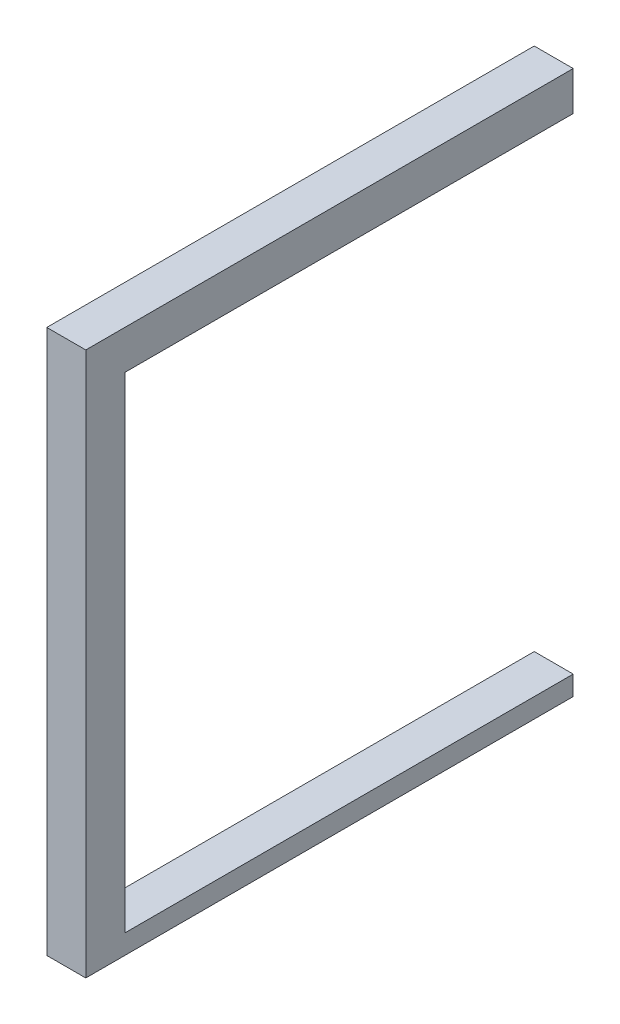
ISO-10303-21;
HEADER;
FILE_DESCRIPTION(('STEP AP214'),'2;1');
FILE_NAME('part.step','',(''),(''),'','','');
FILE_SCHEMA(('AUTOMOTIVE_DESIGN { 1 0 10303 214 1 1 1 1 }'));
ENDSEC;
DATA;
#1=APPLICATION_CONTEXT('core data for automotive mechanical design processes');
#2=APPLICATION_PROTOCOL_DEFINITION('international standard','automotive_design',2000,#1);
#3=PRODUCT_CONTEXT('',#1,'mechanical');
#4=PRODUCT('Part','Part','',(#3));
#5=PRODUCT_RELATED_PRODUCT_CATEGORY('part','',(#4));
#6=PRODUCT_DEFINITION_FORMATION('','',#4);
#7=PRODUCT_DEFINITION_CONTEXT('part definition',#1,'design');
#8=PRODUCT_DEFINITION('design','',#6,#7);
#9=PRODUCT_DEFINITION_SHAPE('','',#8);
#10=(LENGTH_UNIT() NAMED_UNIT(*) SI_UNIT(.MILLI.,.METRE.));
#11=(NAMED_UNIT(*) PLANE_ANGLE_UNIT() SI_UNIT($,.RADIAN.));
#12=(NAMED_UNIT(*) SI_UNIT($,.STERADIAN.) SOLID_ANGLE_UNIT());
#13=UNCERTAINTY_MEASURE_WITH_UNIT(LENGTH_MEASURE(1.E-05),#10,'distance_accuracy_value','');
#14=(GEOMETRIC_REPRESENTATION_CONTEXT(3) GLOBAL_UNCERTAINTY_ASSIGNED_CONTEXT((#13)) GLOBAL_UNIT_ASSIGNED_CONTEXT((#10,
#11,#12)) REPRESENTATION_CONTEXT('',''));
#15=CARTESIAN_POINT('',(0.,0.,0.));
#16=DIRECTION('',(0.,0.,1.));
#17=DIRECTION('',(1.,0.,0.));
#18=AXIS2_PLACEMENT_3D('',#15,#16,#17);
#19=CARTESIAN_POINT('',(40.,0.,-500.));
#20=DIRECTION('',(0.,1.,0.));
#21=DIRECTION('',(0.,0.,1.));
#22=AXIS2_PLACEMENT_3D('',#19,#20,#21);
#23=PLANE('',#22);
#24=DIRECTION('',(0.,0.,-1.));
#25=VECTOR('',#24,1.);
#26=CARTESIAN_POINT('',(0.,0.,-500.));
#27=LINE('',#26,#25);
#28=CARTESIAN_POINT('',(0.,0.,0.));
#29=VERTEX_POINT('',#28);
#30=CARTESIAN_POINT('',(0.,0.,-500.));
#31=VERTEX_POINT('',#30);
#32=EDGE_CURVE('E129',#29,#31,#27,.T.);
#33=ORIENTED_EDGE('',*,*,#32,.T.);
#34=DIRECTION('',(-1.,0.,0.));
#35=VECTOR('',#34,1.);
#36=CARTESIAN_POINT('',(40.,0.,-500.));
#37=LINE('',#36,#35);
#38=CARTESIAN_POINT('',(40.,0.,-500.));
#39=VERTEX_POINT('',#38);
#40=EDGE_CURVE('E11',#39,#31,#37,.T.);
#41=ORIENTED_EDGE('',*,*,#40,.F.);
#42=DIRECTION('',(0.,0.,-1.));
#43=VECTOR('',#42,1.);
#44=CARTESIAN_POINT('',(40.,0.,-500.));
#45=LINE('',#44,#43);
#46=CARTESIAN_POINT('',(40.,0.,0.));
#47=VERTEX_POINT('',#46);
#48=EDGE_CURVE('E143',#47,#39,#45,.T.);
#49=ORIENTED_EDGE('',*,*,#48,.F.);
#50=DIRECTION('',(-1.,0.,0.));
#51=VECTOR('',#50,1.);
#52=CARTESIAN_POINT('',(40.,0.,0.));
#53=LINE('',#52,#51);
#54=EDGE_CURVE('E125',#47,#29,#53,.T.);
#55=ORIENTED_EDGE('',*,*,#54,.T.);
#56=EDGE_LOOP('',(#33,#41,#49,#55));
#57=FACE_BOUND('',#56,.T.);
#58=ADVANCED_FACE('F33',(#57),#23,.F.);
#59=CARTESIAN_POINT('',(40.,20.,-500.));
#60=DIRECTION('',(0.,0.,1.));
#61=DIRECTION('',(1.,0.,0.));
#62=AXIS2_PLACEMENT_3D('',#59,#60,#61);
#63=PLANE('',#62);
#64=DIRECTION('',(0.,1.,0.));
#65=VECTOR('',#64,1.);
#66=CARTESIAN_POINT('',(0.,20.,-500.));
#67=LINE('',#66,#65);
#68=CARTESIAN_POINT('',(0.,20.,-500.));
#69=VERTEX_POINT('',#68);
#70=EDGE_CURVE('E132',#31,#69,#67,.T.);
#71=ORIENTED_EDGE('',*,*,#70,.T.);
#72=DIRECTION('',(-1.,0.,0.));
#73=VECTOR('',#72,1.);
#74=CARTESIAN_POINT('',(40.,20.,-500.));
#75=LINE('',#74,#73);
#76=CARTESIAN_POINT('',(40.,20.,-500.));
#77=VERTEX_POINT('',#76);
#78=EDGE_CURVE('E41',#77,#69,#75,.T.);
#79=ORIENTED_EDGE('',*,*,#78,.F.);
#80=DIRECTION('',(0.,1.,0.));
#81=VECTOR('',#80,1.);
#82=CARTESIAN_POINT('',(40.,20.,-500.));
#83=LINE('',#82,#81);
#84=EDGE_CURVE('E92',#39,#77,#83,.T.);
#85=ORIENTED_EDGE('',*,*,#84,.F.);
#86=ORIENTED_EDGE('',*,*,#40,.T.);
#87=EDGE_LOOP('',(#71,#79,#85,#86));
#88=FACE_BOUND('',#87,.T.);
#89=ADVANCED_FACE('F178',(#88),#63,.F.);
#90=CARTESIAN_POINT('',(40.,20.,-40.));
#91=DIRECTION('',(0.,-1.,0.));
#92=DIRECTION('',(0.,0.,-1.));
#93=AXIS2_PLACEMENT_3D('',#90,#91,#92);
#94=PLANE('',#93);
#95=DIRECTION('',(0.,0.,1.));
#96=VECTOR('',#95,1.);
#97=CARTESIAN_POINT('',(0.,20.,-40.));
#98=LINE('',#97,#96);
#99=CARTESIAN_POINT('',(0.,20.,-40.));
#100=VERTEX_POINT('',#99);
#101=EDGE_CURVE('E134',#69,#100,#98,.T.);
#102=ORIENTED_EDGE('',*,*,#101,.T.);
#103=DIRECTION('',(-1.,0.,0.));
#104=VECTOR('',#103,1.);
#105=CARTESIAN_POINT('',(40.,20.,-40.));
#106=LINE('',#105,#104);
#107=CARTESIAN_POINT('',(40.,20.,-40.));
#108=VERTEX_POINT('',#107);
#109=EDGE_CURVE('E150',#108,#100,#106,.T.);
#110=ORIENTED_EDGE('',*,*,#109,.F.);
#111=DIRECTION('',(0.,0.,1.));
#112=VECTOR('',#111,1.);
#113=CARTESIAN_POINT('',(40.,20.,-40.));
#114=LINE('',#113,#112);
#115=EDGE_CURVE('E158',#77,#108,#114,.T.);
#116=ORIENTED_EDGE('',*,*,#115,.F.);
#117=ORIENTED_EDGE('',*,*,#78,.T.);
#118=EDGE_LOOP('',(#102,#110,#116,#117));
#119=FACE_BOUND('',#118,.T.);
#120=ADVANCED_FACE('F156',(#119),#94,.F.);
#121=CARTESIAN_POINT('',(40.,517.936394634801,-40.));
#122=DIRECTION('',(0.,0.,1.));
#123=DIRECTION('',(0.,-1.,0.));
#124=AXIS2_PLACEMENT_3D('',#121,#122,#123);
#125=PLANE('',#124);
#126=DIRECTION('',(0.,1.,0.));
#127=VECTOR('',#126,1.);
#128=CARTESIAN_POINT('',(0.,517.936394634801,-40.));
#129=LINE('',#128,#127);
#130=CARTESIAN_POINT('',(0.,517.936394634801,-40.));
#131=VERTEX_POINT('',#130);
#132=EDGE_CURVE('E136',#100,#131,#129,.T.);
#133=ORIENTED_EDGE('',*,*,#132,.T.);
#134=DIRECTION('',(-1.,0.,0.));
#135=VECTOR('',#134,1.);
#136=CARTESIAN_POINT('',(40.,517.936394634801,-40.));
#137=LINE('',#136,#135);
#138=CARTESIAN_POINT('',(40.,517.936394634801,-40.));
#139=VERTEX_POINT('',#138);
#140=EDGE_CURVE('E147',#139,#131,#137,.T.);
#141=ORIENTED_EDGE('',*,*,#140,.F.);
#142=DIRECTION('',(0.,1.,0.));
#143=VECTOR('',#142,1.);
#144=CARTESIAN_POINT('',(40.,517.936394634801,-40.));
#145=LINE('',#144,#143);
#146=EDGE_CURVE('E170',#108,#139,#145,.T.);
#147=ORIENTED_EDGE('',*,*,#146,.F.);
#148=ORIENTED_EDGE('',*,*,#109,.T.);
#149=EDGE_LOOP('',(#133,#141,#147,#148));
#150=FACE_BOUND('',#149,.T.);
#151=ADVANCED_FACE('F166',(#150),#125,.F.);
#152=CARTESIAN_POINT('',(40.,517.936394634801,-500.));
#153=DIRECTION('',(0.,1.,0.));
#154=DIRECTION('',(0.,0.,1.));
#155=AXIS2_PLACEMENT_3D('',#152,#153,#154);
#156=PLANE('',#155);
#157=DIRECTION('',(0.,0.,-1.));
#158=VECTOR('',#157,1.);
#159=CARTESIAN_POINT('',(0.,517.936394634801,-500.));
#160=LINE('',#159,#158);
#161=CARTESIAN_POINT('',(0.,517.936394634801,-500.));
#162=VERTEX_POINT('',#161);
#163=EDGE_CURVE('E138',#131,#162,#160,.T.);
#164=ORIENTED_EDGE('',*,*,#163,.T.);
#165=DIRECTION('',(-1.,0.,0.));
#166=VECTOR('',#165,1.);
#167=CARTESIAN_POINT('',(40.,517.936394634801,-500.));
#168=LINE('',#167,#166);
#169=CARTESIAN_POINT('',(40.,517.936394634801,-500.));
#170=VERTEX_POINT('',#169);
#171=EDGE_CURVE('E120',#170,#162,#168,.T.);
#172=ORIENTED_EDGE('',*,*,#171,.F.);
#173=DIRECTION('',(0.,0.,-1.));
#174=VECTOR('',#173,1.);
#175=CARTESIAN_POINT('',(40.,517.936394634801,-500.));
#176=LINE('',#175,#174);
#177=EDGE_CURVE('E111',#139,#170,#176,.T.);
#178=ORIENTED_EDGE('',*,*,#177,.F.);
#179=ORIENTED_EDGE('',*,*,#140,.T.);
#180=EDGE_LOOP('',(#164,#172,#178,#179));
#181=FACE_BOUND('',#180,.T.);
#182=ADVANCED_FACE('F169',(#181),#156,.F.);
#183=CARTESIAN_POINT('',(40.,557.936394634801,-500.));
#184=DIRECTION('',(0.,0.,1.));
#185=DIRECTION('',(1.,0.,0.));
#186=AXIS2_PLACEMENT_3D('',#183,#184,#185);
#187=PLANE('',#186);
#188=DIRECTION('',(0.,1.,0.));
#189=VECTOR('',#188,1.);
#190=CARTESIAN_POINT('',(0.,557.936394634801,-500.));
#191=LINE('',#190,#189);
#192=CARTESIAN_POINT('',(0.,557.936394634801,-500.));
#193=VERTEX_POINT('',#192);
#194=EDGE_CURVE('E119',#162,#193,#191,.T.);
#195=ORIENTED_EDGE('',*,*,#194,.T.);
#196=DIRECTION('',(-1.,0.,0.));
#197=VECTOR('',#196,1.);
#198=CARTESIAN_POINT('',(40.,557.936394634801,-500.));
#199=LINE('',#198,#197);
#200=CARTESIAN_POINT('',(40.,557.936394634801,-500.));
#201=VERTEX_POINT('',#200);
#202=EDGE_CURVE('E116',#201,#193,#199,.T.);
#203=ORIENTED_EDGE('',*,*,#202,.F.);
#204=DIRECTION('',(0.,1.,0.));
#205=VECTOR('',#204,1.);
#206=CARTESIAN_POINT('',(40.,557.936394634801,-500.));
#207=LINE('',#206,#205);
#208=EDGE_CURVE('E105',#170,#201,#207,.T.);
#209=ORIENTED_EDGE('',*,*,#208,.F.);
#210=ORIENTED_EDGE('',*,*,#171,.T.);
#211=EDGE_LOOP('',(#195,#203,#209,#210));
#212=FACE_BOUND('',#211,.T.);
#213=ADVANCED_FACE('F117',(#212),#187,.F.);
#214=CARTESIAN_POINT('',(40.,557.936394634801,0.));
#215=DIRECTION('',(0.,-1.,0.));
#216=DIRECTION('',(0.,0.,-1.));
#217=AXIS2_PLACEMENT_3D('',#214,#215,#216);
#218=PLANE('',#217);
#219=DIRECTION('',(0.,0.,1.));
#220=VECTOR('',#219,1.);
#221=CARTESIAN_POINT('',(0.,557.936394634801,0.));
#222=LINE('',#221,#220);
#223=CARTESIAN_POINT('',(0.,557.936394634801,0.));
#224=VERTEX_POINT('',#223);
#225=EDGE_CURVE('E78',#193,#224,#222,.T.);
#226=ORIENTED_EDGE('',*,*,#225,.T.);
#227=DIRECTION('',(-1.,0.,0.));
#228=VECTOR('',#227,1.);
#229=CARTESIAN_POINT('',(40.,557.936394634801,0.));
#230=LINE('',#229,#228);
#231=CARTESIAN_POINT('',(40.,557.936394634801,0.));
#232=VERTEX_POINT('',#231);
#233=EDGE_CURVE('E121',#232,#224,#230,.T.);
#234=ORIENTED_EDGE('',*,*,#233,.F.);
#235=DIRECTION('',(0.,0.,1.));
#236=VECTOR('',#235,1.);
#237=CARTESIAN_POINT('',(40.,557.936394634801,0.));
#238=LINE('',#237,#236);
#239=EDGE_CURVE('E109',#201,#232,#238,.T.);
#240=ORIENTED_EDGE('',*,*,#239,.F.);
#241=ORIENTED_EDGE('',*,*,#202,.T.);
#242=EDGE_LOOP('',(#226,#234,#240,#241));
#243=FACE_BOUND('',#242,.T.);
#244=ADVANCED_FACE('F123',(#243),#218,.F.);
#245=CARTESIAN_POINT('',(40.,0.,0.));
#246=DIRECTION('',(0.,0.,-1.));
#247=DIRECTION('',(-1.,0.,0.));
#248=AXIS2_PLACEMENT_3D('',#245,#246,#247);
#249=PLANE('',#248);
#250=DIRECTION('',(0.,-1.,0.));
#251=VECTOR('',#250,1.);
#252=CARTESIAN_POINT('',(0.,0.,0.));
#253=LINE('',#252,#251);
#254=EDGE_CURVE('E84',#224,#29,#253,.T.);
#255=ORIENTED_EDGE('',*,*,#254,.T.);
#256=ORIENTED_EDGE('',*,*,#54,.F.);
#257=DIRECTION('',(0.,-1.,0.));
#258=VECTOR('',#257,1.);
#259=CARTESIAN_POINT('',(40.,0.,0.));
#260=LINE('',#259,#258);
#261=EDGE_CURVE('E49',#232,#47,#260,.T.);
#262=ORIENTED_EDGE('',*,*,#261,.F.);
#263=ORIENTED_EDGE('',*,*,#233,.T.);
#264=EDGE_LOOP('',(#255,#256,#262,#263));
#265=FACE_BOUND('',#264,.T.);
#266=ADVANCED_FACE('F194',(#265),#249,.F.);
#267=CARTESIAN_POINT('',(40.,0.,0.));
#268=DIRECTION('',(-1.,0.,0.));
#269=DIRECTION('',(0.,0.,1.));
#270=AXIS2_PLACEMENT_3D('',#267,#268,#269);
#271=PLANE('',#270);
#272=ORIENTED_EDGE('',*,*,#48,.T.);
#273=ORIENTED_EDGE('',*,*,#84,.T.);
#274=ORIENTED_EDGE('',*,*,#115,.T.);
#275=ORIENTED_EDGE('',*,*,#146,.T.);
#276=ORIENTED_EDGE('',*,*,#177,.T.);
#277=ORIENTED_EDGE('',*,*,#208,.T.);
#278=ORIENTED_EDGE('',*,*,#239,.T.);
#279=ORIENTED_EDGE('',*,*,#261,.T.);
#280=EDGE_LOOP('',(#272,#273,#274,#275,#276,#277,#278,#279));
#281=FACE_BOUND('',#280,.T.);
#282=ADVANCED_FACE('F107',(#281),#271,.F.);
#283=CARTESIAN_POINT('',(0.,0.,0.));
#284=DIRECTION('',(-1.,0.,0.));
#285=DIRECTION('',(0.,0.,1.));
#286=AXIS2_PLACEMENT_3D('',#283,#284,#285);
#287=PLANE('',#286);
#288=ORIENTED_EDGE('',*,*,#32,.F.);
#289=ORIENTED_EDGE('',*,*,#254,.F.);
#290=ORIENTED_EDGE('',*,*,#225,.F.);
#291=ORIENTED_EDGE('',*,*,#194,.F.);
#292=ORIENTED_EDGE('',*,*,#163,.F.);
#293=ORIENTED_EDGE('',*,*,#132,.F.);
#294=ORIENTED_EDGE('',*,*,#101,.F.);
#295=ORIENTED_EDGE('',*,*,#70,.F.);
#296=EDGE_LOOP('',(#288,#289,#290,#291,#292,#293,#294,#295));
#297=FACE_BOUND('',#296,.T.);
#298=ADVANCED_FACE('F162',(#297),#287,.T.);
#299=CLOSED_SHELL('',(#58,#89,#120,#151,#182,#213,#244,#266,#282,#298));
#300=MANIFOLD_SOLID_BREP('B2',#299);
#301=ADVANCED_BREP_SHAPE_REPRESENTATION('',(#18,#300),#14);
#302=SHAPE_DEFINITION_REPRESENTATION(#9,#301);
ENDSEC;
END-ISO-10303-21;
